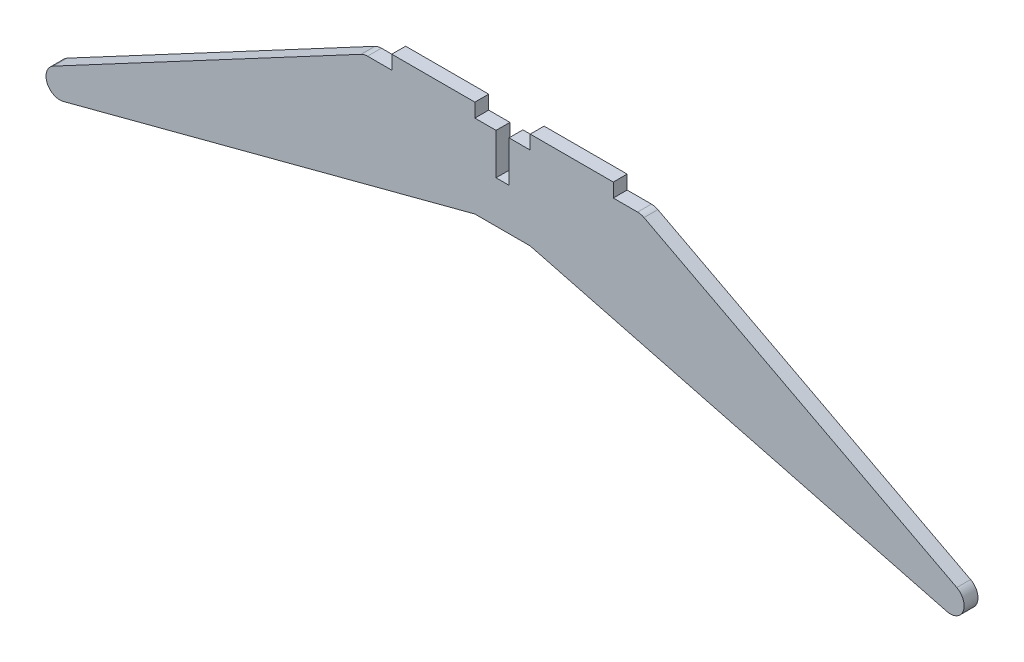
ISO-10303-21;
HEADER;
FILE_DESCRIPTION(('STEP AP214'),'2;1');
FILE_NAME('part.step','',(''),(''),'','','');
FILE_SCHEMA(('AUTOMOTIVE_DESIGN { 1 0 10303 214 1 1 1 1 }'));
ENDSEC;
DATA;
#1=APPLICATION_CONTEXT('core data for automotive mechanical design processes');
#2=APPLICATION_PROTOCOL_DEFINITION('international standard','automotive_design',2000,#1);
#3=PRODUCT_CONTEXT('',#1,'mechanical');
#4=PRODUCT('Part','Part','',(#3));
#5=PRODUCT_RELATED_PRODUCT_CATEGORY('part','',(#4));
#6=PRODUCT_DEFINITION_FORMATION('','',#4);
#7=PRODUCT_DEFINITION_CONTEXT('part definition',#1,'design');
#8=PRODUCT_DEFINITION('design','',#6,#7);
#9=PRODUCT_DEFINITION_SHAPE('','',#8);
#10=(LENGTH_UNIT() NAMED_UNIT(*) SI_UNIT(.MILLI.,.METRE.));
#11=(NAMED_UNIT(*) PLANE_ANGLE_UNIT() SI_UNIT($,.RADIAN.));
#12=(NAMED_UNIT(*) SI_UNIT($,.STERADIAN.) SOLID_ANGLE_UNIT());
#13=UNCERTAINTY_MEASURE_WITH_UNIT(LENGTH_MEASURE(1.E-05),#10,'distance_accuracy_value','');
#14=(GEOMETRIC_REPRESENTATION_CONTEXT(3) GLOBAL_UNCERTAINTY_ASSIGNED_CONTEXT((#13)) GLOBAL_UNIT_ASSIGNED_CONTEXT((#10,
#11,#12)) REPRESENTATION_CONTEXT('',''));
#15=CARTESIAN_POINT('',(0.,0.,0.));
#16=DIRECTION('',(0.,0.,1.));
#17=DIRECTION('',(1.,0.,0.));
#18=AXIS2_PLACEMENT_3D('',#15,#16,#17);
#19=CARTESIAN_POINT('',(25.4,3.17499999999999,3.175));
#20=DIRECTION('',(-1.,0.,0.));
#21=DIRECTION('',(0.,-1.,0.));
#22=AXIS2_PLACEMENT_3D('',#19,#20,#21);
#23=PLANE('',#22);
#24=DIRECTION('',(0.,1.,0.));
#25=VECTOR('',#24,1.);
#26=CARTESIAN_POINT('',(25.4,3.17499999999999,0.));
#27=LINE('',#26,#25);
#28=CARTESIAN_POINT('',(25.4,0.,0.));
#29=VERTEX_POINT('',#28);
#30=CARTESIAN_POINT('',(25.4,3.17499999999999,0.));
#31=VERTEX_POINT('',#30);
#32=EDGE_CURVE('E213',#29,#31,#27,.T.);
#33=ORIENTED_EDGE('',*,*,#32,.T.);
#34=DIRECTION('',(0.,0.,-1.));
#35=VECTOR('',#34,1.);
#36=CARTESIAN_POINT('',(25.4,3.17499999999999,3.175));
#37=LINE('',#36,#35);
#38=CARTESIAN_POINT('',(25.4,3.17499999999999,3.175));
#39=VERTEX_POINT('',#38);
#40=EDGE_CURVE('E11',#39,#31,#37,.T.);
#41=ORIENTED_EDGE('',*,*,#40,.F.);
#42=DIRECTION('',(0.,1.,0.));
#43=VECTOR('',#42,1.);
#44=CARTESIAN_POINT('',(25.4,3.17499999999999,3.175));
#45=LINE('',#44,#43);
#46=CARTESIAN_POINT('',(25.4,0.,3.175));
#47=VERTEX_POINT('',#46);
#48=EDGE_CURVE('E255',#47,#39,#45,.T.);
#49=ORIENTED_EDGE('',*,*,#48,.F.);
#50=DIRECTION('',(0.,0.,-1.));
#51=VECTOR('',#50,1.);
#52=CARTESIAN_POINT('',(25.4,0.,3.175));
#53=LINE('',#52,#51);
#54=EDGE_CURVE('E209',#47,#29,#53,.T.);
#55=ORIENTED_EDGE('',*,*,#54,.T.);
#56=EDGE_LOOP('',(#33,#41,#49,#55));
#57=FACE_BOUND('',#56,.T.);
#58=ADVANCED_FACE('F33',(#57),#23,.F.);
#59=CARTESIAN_POINT('',(6.35,3.175,3.175));
#60=DIRECTION('',(0.,-1.,0.));
#61=DIRECTION('',(1.,0.,0.));
#62=AXIS2_PLACEMENT_3D('',#59,#60,#61);
#63=PLANE('',#62);
#64=DIRECTION('',(-1.,0.,0.));
#65=VECTOR('',#64,1.);
#66=CARTESIAN_POINT('',(6.35,3.175,0.));
#67=LINE('',#66,#65);
#68=CARTESIAN_POINT('',(6.35,3.175,0.));
#69=VERTEX_POINT('',#68);
#70=EDGE_CURVE('E216',#31,#69,#67,.T.);
#71=ORIENTED_EDGE('',*,*,#70,.T.);
#72=DIRECTION('',(0.,0.,-1.));
#73=VECTOR('',#72,1.);
#74=CARTESIAN_POINT('',(6.35,3.175,3.175));
#75=LINE('',#74,#73);
#76=CARTESIAN_POINT('',(6.35,3.175,3.175));
#77=VERTEX_POINT('',#76);
#78=EDGE_CURVE('E41',#77,#69,#75,.T.);
#79=ORIENTED_EDGE('',*,*,#78,.F.);
#80=DIRECTION('',(-1.,0.,0.));
#81=VECTOR('',#80,1.);
#82=CARTESIAN_POINT('',(6.35,3.175,3.175));
#83=LINE('',#82,#81);
#84=EDGE_CURVE('E134',#39,#77,#83,.T.);
#85=ORIENTED_EDGE('',*,*,#84,.F.);
#86=ORIENTED_EDGE('',*,*,#40,.T.);
#87=EDGE_LOOP('',(#71,#79,#85,#86));
#88=FACE_BOUND('',#87,.T.);
#89=ADVANCED_FACE('F383',(#88),#63,.F.);
#90=CARTESIAN_POINT('',(6.35,0.,3.175));
#91=DIRECTION('',(1.,0.,0.));
#92=DIRECTION('',(0.,0.,-1.));
#93=AXIS2_PLACEMENT_3D('',#90,#91,#92);
#94=PLANE('',#93);
#95=DIRECTION('',(0.,-1.,0.));
#96=VECTOR('',#95,1.);
#97=CARTESIAN_POINT('',(6.35,0.,0.));
#98=LINE('',#97,#96);
#99=CARTESIAN_POINT('',(6.35,0.,0.));
#100=VERTEX_POINT('',#99);
#101=EDGE_CURVE('E218',#69,#100,#98,.T.);
#102=ORIENTED_EDGE('',*,*,#101,.T.);
#103=DIRECTION('',(0.,0.,-1.));
#104=VECTOR('',#103,1.);
#105=CARTESIAN_POINT('',(6.35,0.,3.175));
#106=LINE('',#105,#104);
#107=CARTESIAN_POINT('',(6.35,0.,3.175));
#108=VERTEX_POINT('',#107);
#109=EDGE_CURVE('E304',#108,#100,#106,.T.);
#110=ORIENTED_EDGE('',*,*,#109,.F.);
#111=DIRECTION('',(0.,-1.,0.));
#112=VECTOR('',#111,1.);
#113=CARTESIAN_POINT('',(6.35,0.,3.175));
#114=LINE('',#113,#112);
#115=EDGE_CURVE('E312',#77,#108,#114,.T.);
#116=ORIENTED_EDGE('',*,*,#115,.F.);
#117=ORIENTED_EDGE('',*,*,#78,.T.);
#118=EDGE_LOOP('',(#102,#110,#116,#117));
#119=FACE_BOUND('',#118,.T.);
#120=ADVANCED_FACE('F310',(#119),#94,.F.);
#121=CARTESIAN_POINT('',(1.4859,0.,3.175));
#122=DIRECTION('',(0.,-1.,0.));
#123=DIRECTION('',(1.,0.,0.));
#124=AXIS2_PLACEMENT_3D('',#121,#122,#123);
#125=PLANE('',#124);
#126=DIRECTION('',(-1.,0.,0.));
#127=VECTOR('',#126,1.);
#128=CARTESIAN_POINT('',(1.4859,0.,0.));
#129=LINE('',#128,#127);
#130=CARTESIAN_POINT('',(1.4859,0.,0.));
#131=VERTEX_POINT('',#130);
#132=EDGE_CURVE('E220',#100,#131,#129,.T.);
#133=ORIENTED_EDGE('',*,*,#132,.T.);
#134=DIRECTION('',(0.,0.,-1.));
#135=VECTOR('',#134,1.);
#136=CARTESIAN_POINT('',(1.4859,0.,3.175));
#137=LINE('',#136,#135);
#138=CARTESIAN_POINT('',(1.4859,0.,3.175));
#139=VERTEX_POINT('',#138);
#140=EDGE_CURVE('E301',#139,#131,#137,.T.);
#141=ORIENTED_EDGE('',*,*,#140,.F.);
#142=DIRECTION('',(-1.,0.,0.));
#143=VECTOR('',#142,1.);
#144=CARTESIAN_POINT('',(1.4859,0.,3.175));
#145=LINE('',#144,#143);
#146=EDGE_CURVE('E330',#108,#139,#145,.T.);
#147=ORIENTED_EDGE('',*,*,#146,.F.);
#148=ORIENTED_EDGE('',*,*,#109,.T.);
#149=EDGE_LOOP('',(#133,#141,#147,#148));
#150=FACE_BOUND('',#149,.T.);
#151=ADVANCED_FACE('F321',(#150),#125,.F.);
#152=CARTESIAN_POINT('',(1.4859,0.,3.175));
#153=DIRECTION('',(1.,0.,0.));
#154=DIRECTION('',(0.,0.,-1.));
#155=AXIS2_PLACEMENT_3D('',#152,#153,#154);
#156=PLANE('',#155);
#157=DIRECTION('',(0.,-1.,0.));
#158=VECTOR('',#157,1.);
#159=CARTESIAN_POINT('',(1.4859,0.,0.));
#160=LINE('',#159,#158);
#161=CARTESIAN_POINT('',(1.4859,-9.4234,0.));
#162=VERTEX_POINT('',#161);
#163=EDGE_CURVE('E222',#131,#162,#160,.T.);
#164=ORIENTED_EDGE('',*,*,#163,.T.);
#165=DIRECTION('',(0.,0.,-1.));
#166=VECTOR('',#165,1.);
#167=CARTESIAN_POINT('',(1.4859,-9.4234,3.175));
#168=LINE('',#167,#166);
#169=CARTESIAN_POINT('',(1.4859,-9.4234,3.175));
#170=VERTEX_POINT('',#169);
#171=EDGE_CURVE('E298',#170,#162,#168,.T.);
#172=ORIENTED_EDGE('',*,*,#171,.F.);
#173=DIRECTION('',(0.,-1.,0.));
#174=VECTOR('',#173,1.);
#175=CARTESIAN_POINT('',(1.4859,0.,3.175));
#176=LINE('',#175,#174);
#177=EDGE_CURVE('E327',#139,#170,#176,.T.);
#178=ORIENTED_EDGE('',*,*,#177,.F.);
#179=ORIENTED_EDGE('',*,*,#140,.T.);
#180=EDGE_LOOP('',(#164,#172,#178,#179));
#181=FACE_BOUND('',#180,.T.);
#182=ADVANCED_FACE('F325',(#181),#156,.F.);
#183=CARTESIAN_POINT('',(1.4859,-9.4234,3.175));
#184=DIRECTION('',(0.,-1.,0.));
#185=DIRECTION('',(0.,0.,-1.));
#186=AXIS2_PLACEMENT_3D('',#183,#184,#185);
#187=PLANE('',#186);
#188=DIRECTION('',(-1.,0.,0.));
#189=VECTOR('',#188,1.);
#190=CARTESIAN_POINT('',(1.4859,-9.4234,0.));
#191=LINE('',#190,#189);
#192=CARTESIAN_POINT('',(-1.4859,-9.4234,0.));
#193=VERTEX_POINT('',#192);
#194=EDGE_CURVE('E224',#162,#193,#191,.T.);
#195=ORIENTED_EDGE('',*,*,#194,.T.);
#196=DIRECTION('',(0.,0.,-1.));
#197=VECTOR('',#196,1.);
#198=CARTESIAN_POINT('',(-1.4859,-9.4234,3.175));
#199=LINE('',#198,#197);
#200=CARTESIAN_POINT('',(-1.4859,-9.4234,3.175));
#201=VERTEX_POINT('',#200);
#202=EDGE_CURVE('E295',#201,#193,#199,.T.);
#203=ORIENTED_EDGE('',*,*,#202,.F.);
#204=DIRECTION('',(-1.,0.,0.));
#205=VECTOR('',#204,1.);
#206=CARTESIAN_POINT('',(1.4859,-9.4234,3.175));
#207=LINE('',#206,#205);
#208=EDGE_CURVE('E329',#170,#201,#207,.T.);
#209=ORIENTED_EDGE('',*,*,#208,.F.);
#210=ORIENTED_EDGE('',*,*,#171,.T.);
#211=EDGE_LOOP('',(#195,#203,#209,#210));
#212=FACE_BOUND('',#211,.T.);
#213=ADVANCED_FACE('F396',(#212),#187,.F.);
#214=CARTESIAN_POINT('',(-1.4859,0.,3.175));
#215=DIRECTION('',(-1.,0.,0.));
#216=DIRECTION('',(0.,-1.,0.));
#217=AXIS2_PLACEMENT_3D('',#214,#215,#216);
#218=PLANE('',#217);
#219=DIRECTION('',(0.,1.,0.));
#220=VECTOR('',#219,1.);
#221=CARTESIAN_POINT('',(-1.4859,0.,0.));
#222=LINE('',#221,#220);
#223=CARTESIAN_POINT('',(-1.4859,0.,0.));
#224=VERTEX_POINT('',#223);
#225=EDGE_CURVE('E226',#193,#224,#222,.T.);
#226=ORIENTED_EDGE('',*,*,#225,.T.);
#227=DIRECTION('',(0.,0.,-1.));
#228=VECTOR('',#227,1.);
#229=CARTESIAN_POINT('',(-1.4859,0.,3.175));
#230=LINE('',#229,#228);
#231=CARTESIAN_POINT('',(-1.4859,0.,3.175));
#232=VERTEX_POINT('',#231);
#233=EDGE_CURVE('E292',#232,#224,#230,.T.);
#234=ORIENTED_EDGE('',*,*,#233,.F.);
#235=DIRECTION('',(0.,1.,0.));
#236=VECTOR('',#235,1.);
#237=CARTESIAN_POINT('',(-1.4859,0.,3.175));
#238=LINE('',#237,#236);
#239=EDGE_CURVE('E332',#201,#232,#238,.T.);
#240=ORIENTED_EDGE('',*,*,#239,.F.);
#241=ORIENTED_EDGE('',*,*,#202,.T.);
#242=EDGE_LOOP('',(#226,#234,#240,#241));
#243=FACE_BOUND('',#242,.T.);
#244=ADVANCED_FACE('F399',(#243),#218,.F.);
#245=CARTESIAN_POINT('',(-1.4859,0.,3.175));
#246=DIRECTION('',(0.,-1.,0.));
#247=DIRECTION('',(0.,0.,-1.));
#248=AXIS2_PLACEMENT_3D('',#245,#246,#247);
#249=PLANE('',#248);
#250=DIRECTION('',(-1.,0.,0.));
#251=VECTOR('',#250,1.);
#252=CARTESIAN_POINT('',(-1.4859,0.,0.));
#253=LINE('',#252,#251);
#254=CARTESIAN_POINT('',(-6.35,0.,0.));
#255=VERTEX_POINT('',#254);
#256=EDGE_CURVE('E228',#224,#255,#253,.T.);
#257=ORIENTED_EDGE('',*,*,#256,.T.);
#258=DIRECTION('',(0.,0.,-1.));
#259=VECTOR('',#258,1.);
#260=CARTESIAN_POINT('',(-6.35,0.,3.175));
#261=LINE('',#260,#259);
#262=CARTESIAN_POINT('',(-6.35,0.,3.175));
#263=VERTEX_POINT('',#262);
#264=EDGE_CURVE('E289',#263,#255,#261,.T.);
#265=ORIENTED_EDGE('',*,*,#264,.F.);
#266=DIRECTION('',(-1.,0.,0.));
#267=VECTOR('',#266,1.);
#268=CARTESIAN_POINT('',(-1.4859,0.,3.175));
#269=LINE('',#268,#267);
#270=EDGE_CURVE('E338',#232,#263,#269,.T.);
#271=ORIENTED_EDGE('',*,*,#270,.F.);
#272=ORIENTED_EDGE('',*,*,#233,.T.);
#273=EDGE_LOOP('',(#257,#265,#271,#272));
#274=FACE_BOUND('',#273,.T.);
#275=ADVANCED_FACE('F403',(#274),#249,.F.);
#276=CARTESIAN_POINT('',(-6.35,3.175,3.175));
#277=DIRECTION('',(-1.,0.,0.));
#278=DIRECTION('',(0.,0.,1.));
#279=AXIS2_PLACEMENT_3D('',#276,#277,#278);
#280=PLANE('',#279);
#281=DIRECTION('',(0.,1.,0.));
#282=VECTOR('',#281,1.);
#283=CARTESIAN_POINT('',(-6.35,3.175,0.));
#284=LINE('',#283,#282);
#285=CARTESIAN_POINT('',(-6.35,3.175,0.));
#286=VERTEX_POINT('',#285);
#287=EDGE_CURVE('E230',#255,#286,#284,.T.);
#288=ORIENTED_EDGE('',*,*,#287,.T.);
#289=DIRECTION('',(0.,0.,-1.));
#290=VECTOR('',#289,1.);
#291=CARTESIAN_POINT('',(-6.35,3.175,3.175));
#292=LINE('',#291,#290);
#293=CARTESIAN_POINT('',(-6.35,3.175,3.175));
#294=VERTEX_POINT('',#293);
#295=EDGE_CURVE('E286',#294,#286,#292,.T.);
#296=ORIENTED_EDGE('',*,*,#295,.F.);
#297=DIRECTION('',(0.,1.,0.));
#298=VECTOR('',#297,1.);
#299=CARTESIAN_POINT('',(-6.35,3.175,3.175));
#300=LINE('',#299,#298);
#301=EDGE_CURVE('E340',#263,#294,#300,.T.);
#302=ORIENTED_EDGE('',*,*,#301,.F.);
#303=ORIENTED_EDGE('',*,*,#264,.T.);
#304=EDGE_LOOP('',(#288,#296,#302,#303));
#305=FACE_BOUND('',#304,.T.);
#306=ADVANCED_FACE('F407',(#305),#280,.F.);
#307=CARTESIAN_POINT('',(-6.35,3.175,3.175));
#308=DIRECTION('',(0.,-1.,0.));
#309=DIRECTION('',(0.,0.,-1.));
#310=AXIS2_PLACEMENT_3D('',#307,#308,#309);
#311=PLANE('',#310);
#312=DIRECTION('',(-1.,0.,0.));
#313=VECTOR('',#312,1.);
#314=CARTESIAN_POINT('',(-6.35,3.175,0.));
#315=LINE('',#314,#313);
#316=CARTESIAN_POINT('',(-25.4,3.175,0.));
#317=VERTEX_POINT('',#316);
#318=EDGE_CURVE('E232',#286,#317,#315,.T.);
#319=ORIENTED_EDGE('',*,*,#318,.T.);
#320=DIRECTION('',(0.,0.,-1.));
#321=VECTOR('',#320,1.);
#322=CARTESIAN_POINT('',(-25.4,3.175,3.175));
#323=LINE('',#322,#321);
#324=CARTESIAN_POINT('',(-25.4,3.175,3.175));
#325=VERTEX_POINT('',#324);
#326=EDGE_CURVE('E283',#325,#317,#323,.T.);
#327=ORIENTED_EDGE('',*,*,#326,.F.);
#328=DIRECTION('',(-1.,0.,0.));
#329=VECTOR('',#328,1.);
#330=CARTESIAN_POINT('',(-6.35,3.175,3.175));
#331=LINE('',#330,#329);
#332=EDGE_CURVE('E342',#294,#325,#331,.T.);
#333=ORIENTED_EDGE('',*,*,#332,.F.);
#334=ORIENTED_EDGE('',*,*,#295,.T.);
#335=EDGE_LOOP('',(#319,#327,#333,#334));
#336=FACE_BOUND('',#335,.T.);
#337=ADVANCED_FACE('F411',(#336),#311,.F.);
#338=CARTESIAN_POINT('',(-25.4,0.,3.175));
#339=DIRECTION('',(1.,0.,0.));
#340=DIRECTION('',(0.,1.,0.));
#341=AXIS2_PLACEMENT_3D('',#338,#339,#340);
#342=PLANE('',#341);
#343=DIRECTION('',(0.,-1.,0.));
#344=VECTOR('',#343,1.);
#345=CARTESIAN_POINT('',(-25.4,0.,0.));
#346=LINE('',#345,#344);
#347=CARTESIAN_POINT('',(-25.4,0.,0.));
#348=VERTEX_POINT('',#347);
#349=EDGE_CURVE('E234',#317,#348,#346,.T.);
#350=ORIENTED_EDGE('',*,*,#349,.T.);
#351=DIRECTION('',(0.,0.,-1.));
#352=VECTOR('',#351,1.);
#353=CARTESIAN_POINT('',(-25.4,0.,3.175));
#354=LINE('',#353,#352);
#355=CARTESIAN_POINT('',(-25.4,0.,3.175));
#356=VERTEX_POINT('',#355);
#357=EDGE_CURVE('E280',#356,#348,#354,.T.);
#358=ORIENTED_EDGE('',*,*,#357,.F.);
#359=DIRECTION('',(0.,-1.,0.));
#360=VECTOR('',#359,1.);
#361=CARTESIAN_POINT('',(-25.4,0.,3.175));
#362=LINE('',#361,#360);
#363=EDGE_CURVE('E344',#325,#356,#362,.T.);
#364=ORIENTED_EDGE('',*,*,#363,.F.);
#365=ORIENTED_EDGE('',*,*,#326,.T.);
#366=EDGE_LOOP('',(#350,#358,#364,#365));
#367=FACE_BOUND('',#366,.T.);
#368=ADVANCED_FACE('F415',(#367),#342,.F.);
#369=CARTESIAN_POINT('',(-25.4,0.,3.175));
#370=DIRECTION('',(0.,-1.,0.));
#371=DIRECTION('',(1.,0.,0.));
#372=AXIS2_PLACEMENT_3D('',#369,#370,#371);
#373=PLANE('',#372);
#374=DIRECTION('',(-1.,0.,0.));
#375=VECTOR('',#374,1.);
#376=CARTESIAN_POINT('',(-25.4,0.,0.));
#377=LINE('',#376,#375);
#378=CARTESIAN_POINT('',(-30.95625,0.,0.));
#379=VERTEX_POINT('',#378);
#380=EDGE_CURVE('E236',#348,#379,#377,.T.);
#381=ORIENTED_EDGE('',*,*,#380,.T.);
#382=DIRECTION('',(0.,0.,-1.));
#383=VECTOR('',#382,1.);
#384=CARTESIAN_POINT('',(-30.95625,0.,3.175));
#385=LINE('',#384,#383);
#386=CARTESIAN_POINT('',(-30.95625,0.,3.175));
#387=VERTEX_POINT('',#386);
#388=EDGE_CURVE('E277',#387,#379,#385,.T.);
#389=ORIENTED_EDGE('',*,*,#388,.F.);
#390=DIRECTION('',(-1.,0.,0.));
#391=VECTOR('',#390,1.);
#392=CARTESIAN_POINT('',(-25.4,0.,3.175));
#393=LINE('',#392,#391);
#394=EDGE_CURVE('E346',#356,#387,#393,.T.);
#395=ORIENTED_EDGE('',*,*,#394,.F.);
#396=ORIENTED_EDGE('',*,*,#357,.T.);
#397=EDGE_LOOP('',(#381,#389,#395,#396));
#398=FACE_BOUND('',#397,.T.);
#399=ADVANCED_FACE('F419',(#398),#373,.F.);
#400=CARTESIAN_POINT('',(-30.95625,-3.175,3.175));
#401=DIRECTION('',(0.,0.,-1.));
#402=DIRECTION('',(-1.,0.,0.));
#403=AXIS2_PLACEMENT_3D('',#400,#401,#402);
#404=CYLINDRICAL_SURFACE('',#403,3.17499999999993);
#405=CARTESIAN_POINT('',(-30.95625,-3.175,0.));
#406=DIRECTION('',(0.,0.,1.));
#407=DIRECTION('',(1.,0.,0.));
#408=AXIS2_PLACEMENT_3D('',#405,#406,#407);
#409=CIRCLE('',#408,3.17499999999993);
#410=CARTESIAN_POINT('',(-32.4503676470611,-0.373529411765991,0.));
#411=VERTEX_POINT('',#410);
#412=EDGE_CURVE('E238',#379,#411,#409,.T.);
#413=ORIENTED_EDGE('',*,*,#412,.T.);
#414=DIRECTION('',(0.,0.,-1.));
#415=VECTOR('',#414,1.);
#416=CARTESIAN_POINT('',(-32.4503676470611,-0.373529411765991,3.175));
#417=LINE('',#416,#415);
#418=CARTESIAN_POINT('',(-32.4503676470611,-0.373529411765991,3.175));
#419=VERTEX_POINT('',#418);
#420=EDGE_CURVE('E274',#419,#411,#417,.T.);
#421=ORIENTED_EDGE('',*,*,#420,.F.);
#422=CARTESIAN_POINT('',(-30.95625,-3.175,3.175));
#423=DIRECTION('',(0.,0.,1.));
#424=DIRECTION('',(1.,0.,0.));
#425=AXIS2_PLACEMENT_3D('',#422,#423,#424);
#426=CIRCLE('',#425,3.17499999999993);
#427=EDGE_CURVE('E348',#387,#419,#426,.T.);
#428=ORIENTED_EDGE('',*,*,#427,.F.);
#429=ORIENTED_EDGE('',*,*,#388,.T.);
#430=EDGE_LOOP('',(#413,#421,#428,#429));
#431=FACE_BOUND('',#430,.T.);
#432=ADVANCED_FACE('F423',(#431),#404,.T.);
#433=CARTESIAN_POINT('',(-32.4503676470611,-0.373529411765991,3.175));
#434=DIRECTION('',(0.470588235285875,-0.882352941180867,0.));
#435=DIRECTION('',(0.882352941180867,0.470588235285875,0.));
#436=AXIS2_PLACEMENT_3D('',#433,#434,#435);
#437=PLANE('',#436);
#438=DIRECTION('',(-0.882352941180867,-0.470588235285875,0.));
#439=VECTOR('',#438,1.);
#440=CARTESIAN_POINT('',(-32.4503676470611,-0.373529411765991,0.));
#441=LINE('',#440,#439);
#442=CARTESIAN_POINT('',(-103.0238866239,-38.0127395319,0.));
#443=VERTEX_POINT('',#442);
#444=EDGE_CURVE('E240',#411,#443,#441,.T.);
#445=ORIENTED_EDGE('',*,*,#444,.T.);
#446=DIRECTION('',(0.,0.,-1.));
#447=VECTOR('',#446,1.);
#448=CARTESIAN_POINT('',(-103.0238866239,-38.0127395319,3.175));
#449=LINE('',#448,#447);
#450=CARTESIAN_POINT('',(-103.0238866239,-38.0127395319,3.175));
#451=VERTEX_POINT('',#450);
#452=EDGE_CURVE('E271',#451,#443,#449,.T.);
#453=ORIENTED_EDGE('',*,*,#452,.F.);
#454=DIRECTION('',(-0.882352941180867,-0.470588235285875,0.));
#455=VECTOR('',#454,1.);
#456=CARTESIAN_POINT('',(-32.4503676470611,-0.373529411765991,3.175));
#457=LINE('',#456,#455);
#458=EDGE_CURVE('E350',#419,#451,#457,.T.);
#459=ORIENTED_EDGE('',*,*,#458,.F.);
#460=ORIENTED_EDGE('',*,*,#420,.T.);
#461=EDGE_LOOP('',(#445,#453,#459,#460));
#462=FACE_BOUND('',#461,.T.);
#463=ADVANCED_FACE('F427',(#462),#437,.F.);
#464=CARTESIAN_POINT('',(-101.529768981532,-40.8142101226359,3.175));
#465=DIRECTION('',(0.,0.,-1.));
#466=DIRECTION('',(-1.,0.,0.));
#467=AXIS2_PLACEMENT_3D('',#464,#465,#466);
#468=CYLINDRICAL_SURFACE('',#467,3.17499999999878);
#469=CARTESIAN_POINT('',(-101.529768981532,-40.8142101226359,0.));
#470=DIRECTION('',(0.,0.,1.));
#471=DIRECTION('',(1.,0.,0.));
#472=AXIS2_PLACEMENT_3D('',#469,#470,#471);
#473=CIRCLE('',#472,3.17499999999878);
#474=CARTESIAN_POINT('',(-100.721752751926,-43.8846717772873,0.));
#475=VERTEX_POINT('',#474);
#476=EDGE_CURVE('E242',#443,#475,#473,.T.);
#477=ORIENTED_EDGE('',*,*,#476,.T.);
#478=DIRECTION('',(0.,0.,-1.));
#479=VECTOR('',#478,1.);
#480=CARTESIAN_POINT('',(-100.721752751926,-43.8846717772873,3.175));
#481=LINE('',#480,#479);
#482=CARTESIAN_POINT('',(-100.721752751926,-43.8846717772873,3.175));
#483=VERTEX_POINT('',#482);
#484=EDGE_CURVE('E268',#483,#475,#481,.T.);
#485=ORIENTED_EDGE('',*,*,#484,.F.);
#486=CARTESIAN_POINT('',(-101.529768981532,-40.8142101226359,3.175));
#487=DIRECTION('',(0.,0.,1.));
#488=DIRECTION('',(1.,0.,0.));
#489=AXIS2_PLACEMENT_3D('',#486,#487,#488);
#490=CIRCLE('',#489,3.17499999999878);
#491=EDGE_CURVE('E352',#451,#483,#490,.T.);
#492=ORIENTED_EDGE('',*,*,#491,.F.);
#493=ORIENTED_EDGE('',*,*,#452,.T.);
#494=EDGE_LOOP('',(#477,#485,#492,#493));
#495=FACE_BOUND('',#494,.T.);
#496=ADVANCED_FACE('F431',(#495),#468,.T.);
#497=CARTESIAN_POINT('',(-100.721752751926,-43.8846717772873,3.175));
#498=DIRECTION('',(-0.254493299284097,0.967074537261474,0.));
#499=DIRECTION('',(-0.967074537261474,-0.254493299284097,0.));
#500=AXIS2_PLACEMENT_3D('',#497,#498,#499);
#501=PLANE('',#500);
#502=DIRECTION('',(0.967074537261474,0.254493299284097,0.));
#503=VECTOR('',#502,1.);
#504=CARTESIAN_POINT('',(-100.721752751926,-43.8846717772873,0.));
#505=LINE('',#504,#503);
#506=CARTESIAN_POINT('',(-6.35,-19.05,0.));
#507=VERTEX_POINT('',#506);
#508=EDGE_CURVE('E244',#475,#507,#505,.T.);
#509=ORIENTED_EDGE('',*,*,#508,.T.);
#510=DIRECTION('',(0.,0.,-1.));
#511=VECTOR('',#510,1.);
#512=CARTESIAN_POINT('',(-6.35,-19.05,3.175));
#513=LINE('',#512,#511);
#514=CARTESIAN_POINT('',(-6.35,-19.05,3.175));
#515=VERTEX_POINT('',#514);
#516=EDGE_CURVE('E265',#515,#507,#513,.T.);
#517=ORIENTED_EDGE('',*,*,#516,.F.);
#518=DIRECTION('',(0.967074537261474,0.254493299284097,0.));
#519=VECTOR('',#518,1.);
#520=CARTESIAN_POINT('',(-100.721752751926,-43.8846717772873,3.175));
#521=LINE('',#520,#519);
#522=EDGE_CURVE('E354',#483,#515,#521,.T.);
#523=ORIENTED_EDGE('',*,*,#522,.F.);
#524=ORIENTED_EDGE('',*,*,#484,.T.);
#525=EDGE_LOOP('',(#509,#517,#523,#524));
#526=FACE_BOUND('',#525,.T.);
#527=ADVANCED_FACE('F435',(#526),#501,.F.);
#528=CARTESIAN_POINT('',(-6.35,-19.05,3.175));
#529=DIRECTION('',(0.,1.,0.));
#530=DIRECTION('',(0.,0.,1.));
#531=AXIS2_PLACEMENT_3D('',#528,#529,#530);
#532=PLANE('',#531);
#533=DIRECTION('',(1.,0.,0.));
#534=VECTOR('',#533,1.);
#535=CARTESIAN_POINT('',(-6.35,-19.05,0.));
#536=LINE('',#535,#534);
#537=CARTESIAN_POINT('',(6.35,-19.05,0.));
#538=VERTEX_POINT('',#537);
#539=EDGE_CURVE('E246',#507,#538,#536,.T.);
#540=ORIENTED_EDGE('',*,*,#539,.T.);
#541=DIRECTION('',(0.,0.,-1.));
#542=VECTOR('',#541,1.);
#543=CARTESIAN_POINT('',(6.35,-19.05,3.175));
#544=LINE('',#543,#542);
#545=CARTESIAN_POINT('',(6.35,-19.05,3.175));
#546=VERTEX_POINT('',#545);
#547=EDGE_CURVE('E262',#546,#538,#544,.T.);
#548=ORIENTED_EDGE('',*,*,#547,.F.);
#549=DIRECTION('',(1.,0.,0.));
#550=VECTOR('',#549,1.);
#551=CARTESIAN_POINT('',(-6.35,-19.05,3.175));
#552=LINE('',#551,#550);
#553=EDGE_CURVE('E356',#515,#546,#552,.T.);
#554=ORIENTED_EDGE('',*,*,#553,.F.);
#555=ORIENTED_EDGE('',*,*,#516,.T.);
#556=EDGE_LOOP('',(#540,#548,#554,#555));
#557=FACE_BOUND('',#556,.T.);
#558=ADVANCED_FACE('F439',(#557),#532,.F.);
#559=CARTESIAN_POINT('',(6.35,-19.05,3.175));
#560=DIRECTION('',(0.251328478078434,0.967901852517484,0.));
#561=DIRECTION('',(-0.967901852517485,0.251328478078434,0.));
#562=AXIS2_PLACEMENT_3D('',#559,#560,#561);
#563=PLANE('',#562);
#564=DIRECTION('',(0.967901852517485,-0.251328478078434,0.));
#565=VECTOR('',#564,1.);
#566=CARTESIAN_POINT('',(6.35,-19.05,0.));
#567=LINE('',#566,#565);
#568=CARTESIAN_POINT('',(101.892440564182,-43.8588544478339,0.));
#569=VERTEX_POINT('',#568);
#570=EDGE_CURVE('E248',#538,#569,#567,.T.);
#571=ORIENTED_EDGE('',*,*,#570,.T.);
#572=DIRECTION('',(0.,0.,-1.));
#573=VECTOR('',#572,1.);
#574=CARTESIAN_POINT('',(101.892440564182,-43.8588544478339,3.175));
#575=LINE('',#574,#573);
#576=CARTESIAN_POINT('',(101.892440564182,-43.8588544478339,3.175));
#577=VERTEX_POINT('',#576);
#578=EDGE_CURVE('E259',#577,#569,#575,.T.);
#579=ORIENTED_EDGE('',*,*,#578,.F.);
#580=DIRECTION('',(0.967901852517485,-0.251328478078434,0.));
#581=VECTOR('',#580,1.);
#582=CARTESIAN_POINT('',(6.35,-19.05,3.175));
#583=LINE('',#582,#581);
#584=EDGE_CURVE('E358',#546,#577,#583,.T.);
#585=ORIENTED_EDGE('',*,*,#584,.F.);
#586=ORIENTED_EDGE('',*,*,#547,.T.);
#587=EDGE_LOOP('',(#571,#579,#585,#586));
#588=FACE_BOUND('',#587,.T.);
#589=ADVANCED_FACE('F364',(#588),#563,.F.);
#590=CARTESIAN_POINT('',(102.69040848212,-40.7857660661,3.175));
#591=DIRECTION('',(0.,0.,-1.));
#592=DIRECTION('',(-1.,0.,0.));
#593=AXIS2_PLACEMENT_3D('',#590,#591,#592);
#594=CYLINDRICAL_SURFACE('',#593,3.17500000000096);
#595=CARTESIAN_POINT('',(102.69040848212,-40.7857660661,0.));
#596=DIRECTION('',(0.,0.,1.));
#597=DIRECTION('',(1.,0.,0.));
#598=AXIS2_PLACEMENT_3D('',#595,#596,#597);
#599=CIRCLE('',#598,3.17500000000096);
#600=CARTESIAN_POINT('',(104.164919451924,-37.9739263836264,0.));
#601=VERTEX_POINT('',#600);
#602=EDGE_CURVE('E250',#569,#601,#599,.T.);
#603=ORIENTED_EDGE('',*,*,#602,.T.);
#604=DIRECTION('',(0.,0.,-1.));
#605=VECTOR('',#604,1.);
#606=CARTESIAN_POINT('',(104.164919451924,-37.9739263836264,3.175));
#607=LINE('',#606,#605);
#608=CARTESIAN_POINT('',(104.164919451924,-37.9739263836264,3.175));
#609=VERTEX_POINT('',#608);
#610=EDGE_CURVE('E204',#609,#601,#607,.T.);
#611=ORIENTED_EDGE('',*,*,#610,.F.);
#612=CARTESIAN_POINT('',(102.69040848212,-40.7857660661,3.175));
#613=DIRECTION('',(0.,0.,1.));
#614=DIRECTION('',(1.,0.,0.));
#615=AXIS2_PLACEMENT_3D('',#612,#613,#614);
#616=CIRCLE('',#615,3.17500000000096);
#617=EDGE_CURVE('E195',#577,#609,#616,.T.);
#618=ORIENTED_EDGE('',*,*,#617,.F.);
#619=ORIENTED_EDGE('',*,*,#578,.T.);
#620=EDGE_LOOP('',(#603,#611,#618,#619));
#621=FACE_BOUND('',#620,.T.);
#622=ADVANCED_FACE('F368',(#621),#594,.T.);
#623=CARTESIAN_POINT('',(104.164919451924,-37.9739263836264,3.175));
#624=DIRECTION('',(-0.464412903852295,-0.885618797641219,0.));
#625=DIRECTION('',(0.885618797641219,-0.464412903852295,0.));
#626=AXIS2_PLACEMENT_3D('',#623,#624,#625);
#627=PLANE('',#626);
#628=DIRECTION('',(-0.885618797641219,0.464412903852295,0.));
#629=VECTOR('',#628,1.);
#630=CARTESIAN_POINT('',(104.164919451924,-37.9739263836264,0.));
#631=LINE('',#630,#629);
#632=CARTESIAN_POINT('',(32.44253373558,-0.36316031762,0.));
#633=VERTEX_POINT('',#632);
#634=EDGE_CURVE('E203',#601,#633,#631,.T.);
#635=ORIENTED_EDGE('',*,*,#634,.T.);
#636=DIRECTION('',(0.,0.,-1.));
#637=VECTOR('',#636,1.);
#638=CARTESIAN_POINT('',(32.44253373558,-0.36316031762,3.175));
#639=LINE('',#638,#637);
#640=CARTESIAN_POINT('',(32.44253373558,-0.36316031762,3.175));
#641=VERTEX_POINT('',#640);
#642=EDGE_CURVE('E200',#641,#633,#639,.T.);
#643=ORIENTED_EDGE('',*,*,#642,.F.);
#644=DIRECTION('',(-0.885618797641219,0.464412903852295,0.));
#645=VECTOR('',#644,1.);
#646=CARTESIAN_POINT('',(104.164919451924,-37.9739263836264,3.175));
#647=LINE('',#646,#645);
#648=EDGE_CURVE('E189',#609,#641,#647,.T.);
#649=ORIENTED_EDGE('',*,*,#648,.F.);
#650=ORIENTED_EDGE('',*,*,#610,.T.);
#651=EDGE_LOOP('',(#635,#643,#649,#650));
#652=FACE_BOUND('',#651,.T.);
#653=ADVANCED_FACE('F201',(#652),#627,.F.);
#654=CARTESIAN_POINT('',(30.9680227655993,-3.175,3.175));
#655=DIRECTION('',(0.,0.,-1.));
#656=DIRECTION('',(-1.,0.,0.));
#657=AXIS2_PLACEMENT_3D('',#654,#655,#656);
#658=CYLINDRICAL_SURFACE('',#657,3.17500000000003);
#659=CARTESIAN_POINT('',(30.9680227655993,-3.175,0.));
#660=DIRECTION('',(0.,0.,1.));
#661=DIRECTION('',(1.,0.,0.));
#662=AXIS2_PLACEMENT_3D('',#659,#660,#661);
#663=CIRCLE('',#662,3.17500000000003);
#664=CARTESIAN_POINT('',(30.96802276792,0.,0.));
#665=VERTEX_POINT('',#664);
#666=EDGE_CURVE('E120',#633,#665,#663,.T.);
#667=ORIENTED_EDGE('',*,*,#666,.T.);
#668=DIRECTION('',(0.,0.,-1.));
#669=VECTOR('',#668,1.);
#670=CARTESIAN_POINT('',(30.96802276792,0.,3.175));
#671=LINE('',#670,#669);
#672=CARTESIAN_POINT('',(30.96802276792,0.,3.175));
#673=VERTEX_POINT('',#672);
#674=EDGE_CURVE('E205',#673,#665,#671,.T.);
#675=ORIENTED_EDGE('',*,*,#674,.F.);
#676=CARTESIAN_POINT('',(30.9680227655993,-3.175,3.175));
#677=DIRECTION('',(0.,0.,1.));
#678=DIRECTION('',(1.,0.,0.));
#679=AXIS2_PLACEMENT_3D('',#676,#677,#678);
#680=CIRCLE('',#679,3.17500000000003);
#681=EDGE_CURVE('E193',#641,#673,#680,.T.);
#682=ORIENTED_EDGE('',*,*,#681,.F.);
#683=ORIENTED_EDGE('',*,*,#642,.T.);
#684=EDGE_LOOP('',(#667,#675,#682,#683));
#685=FACE_BOUND('',#684,.T.);
#686=ADVANCED_FACE('F207',(#685),#658,.T.);
#687=CARTESIAN_POINT('',(25.4,0.,3.175));
#688=DIRECTION('',(0.,-1.,0.));
#689=DIRECTION('',(1.,0.,0.));
#690=AXIS2_PLACEMENT_3D('',#687,#688,#689);
#691=PLANE('',#690);
#692=DIRECTION('',(-1.,0.,0.));
#693=VECTOR('',#692,1.);
#694=CARTESIAN_POINT('',(25.4,0.,0.));
#695=LINE('',#694,#693);
#696=EDGE_CURVE('E126',#665,#29,#695,.T.);
#697=ORIENTED_EDGE('',*,*,#696,.T.);
#698=ORIENTED_EDGE('',*,*,#54,.F.);
#699=DIRECTION('',(-1.,0.,0.));
#700=VECTOR('',#699,1.);
#701=CARTESIAN_POINT('',(25.4,0.,3.175));
#702=LINE('',#701,#700);
#703=EDGE_CURVE('E49',#673,#47,#702,.T.);
#704=ORIENTED_EDGE('',*,*,#703,.F.);
#705=ORIENTED_EDGE('',*,*,#674,.T.);
#706=EDGE_LOOP('',(#697,#698,#704,#705));
#707=FACE_BOUND('',#706,.T.);
#708=ADVANCED_FACE('F372',(#707),#691,.F.);
#709=CARTESIAN_POINT('',(30.9680227655993,-3.175,3.175));
#710=DIRECTION('',(0.,0.,1.));
#711=DIRECTION('',(1.,0.,0.));
#712=AXIS2_PLACEMENT_3D('',#709,#710,#711);
#713=PLANE('',#712);
#714=ORIENTED_EDGE('',*,*,#48,.T.);
#715=ORIENTED_EDGE('',*,*,#84,.T.);
#716=ORIENTED_EDGE('',*,*,#115,.T.);
#717=ORIENTED_EDGE('',*,*,#146,.T.);
#718=ORIENTED_EDGE('',*,*,#177,.T.);
#719=ORIENTED_EDGE('',*,*,#208,.T.);
#720=ORIENTED_EDGE('',*,*,#239,.T.);
#721=ORIENTED_EDGE('',*,*,#270,.T.);
#722=ORIENTED_EDGE('',*,*,#301,.T.);
#723=ORIENTED_EDGE('',*,*,#332,.T.);
#724=ORIENTED_EDGE('',*,*,#363,.T.);
#725=ORIENTED_EDGE('',*,*,#394,.T.);
#726=ORIENTED_EDGE('',*,*,#427,.T.);
#727=ORIENTED_EDGE('',*,*,#458,.T.);
#728=ORIENTED_EDGE('',*,*,#491,.T.);
#729=ORIENTED_EDGE('',*,*,#522,.T.);
#730=ORIENTED_EDGE('',*,*,#553,.T.);
#731=ORIENTED_EDGE('',*,*,#584,.T.);
#732=ORIENTED_EDGE('',*,*,#617,.T.);
#733=ORIENTED_EDGE('',*,*,#648,.T.);
#734=ORIENTED_EDGE('',*,*,#681,.T.);
#735=ORIENTED_EDGE('',*,*,#703,.T.);
#736=EDGE_LOOP('',(#714,#715,#716,#717,#718,#719,#720,#721,#722,#723,#724,#725,#726,#727,#728,
#729,#730,#731,#732,#733,#734,#735));
#737=FACE_BOUND('',#736,.T.);
#738=ADVANCED_FACE('F191',(#737),#713,.T.);
#739=CARTESIAN_POINT('',(30.9680227655993,-3.175,0.));
#740=DIRECTION('',(0.,0.,1.));
#741=DIRECTION('',(1.,0.,0.));
#742=AXIS2_PLACEMENT_3D('',#739,#740,#741);
#743=PLANE('',#742);
#744=ORIENTED_EDGE('',*,*,#32,.F.);
#745=ORIENTED_EDGE('',*,*,#696,.F.);
#746=ORIENTED_EDGE('',*,*,#666,.F.);
#747=ORIENTED_EDGE('',*,*,#634,.F.);
#748=ORIENTED_EDGE('',*,*,#602,.F.);
#749=ORIENTED_EDGE('',*,*,#570,.F.);
#750=ORIENTED_EDGE('',*,*,#539,.F.);
#751=ORIENTED_EDGE('',*,*,#508,.F.);
#752=ORIENTED_EDGE('',*,*,#476,.F.);
#753=ORIENTED_EDGE('',*,*,#444,.F.);
#754=ORIENTED_EDGE('',*,*,#412,.F.);
#755=ORIENTED_EDGE('',*,*,#380,.F.);
#756=ORIENTED_EDGE('',*,*,#349,.F.);
#757=ORIENTED_EDGE('',*,*,#318,.F.);
#758=ORIENTED_EDGE('',*,*,#287,.F.);
#759=ORIENTED_EDGE('',*,*,#256,.F.);
#760=ORIENTED_EDGE('',*,*,#225,.F.);
#761=ORIENTED_EDGE('',*,*,#194,.F.);
#762=ORIENTED_EDGE('',*,*,#163,.F.);
#763=ORIENTED_EDGE('',*,*,#132,.F.);
#764=ORIENTED_EDGE('',*,*,#101,.F.);
#765=ORIENTED_EDGE('',*,*,#70,.F.);
#766=EDGE_LOOP('',(#744,#745,#746,#747,#748,#749,#750,#751,#752,#753,#754,#755,#756,#757,#758,
#759,#760,#761,#762,#763,#764,#765));
#767=FACE_BOUND('',#766,.T.);
#768=ADVANCED_FACE('F316',(#767),#743,.F.);
#769=CLOSED_SHELL('',(#58,#89,#120,#151,#182,#213,#244,#275,#306,#337,#368,#399,#432,#463,#496,
#527,#558,#589,#622,#653,#686,#708,#738,#768));
#770=MANIFOLD_SOLID_BREP('B2',#769);
#771=ADVANCED_BREP_SHAPE_REPRESENTATION('',(#18,#770),#14);
#772=SHAPE_DEFINITION_REPRESENTATION(#9,#771);
ENDSEC;
END-ISO-10303-21;
